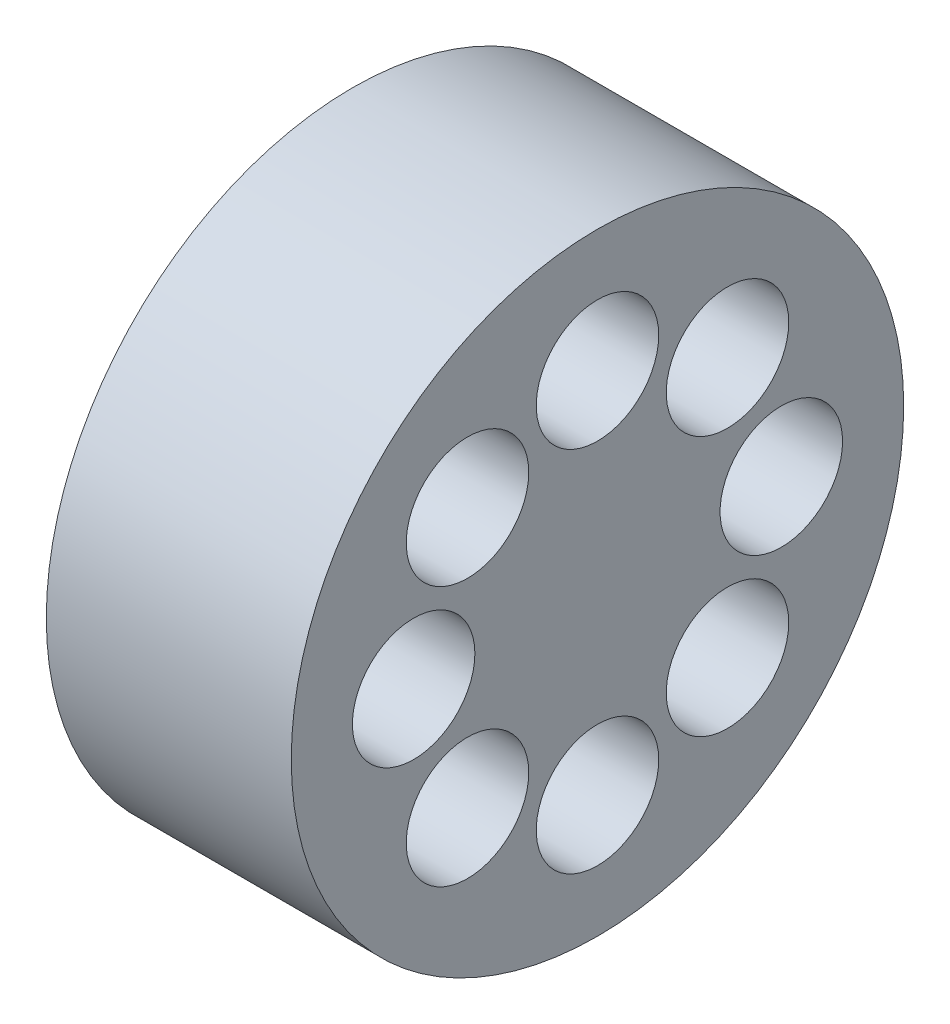
ISO-10303-21;
HEADER;
FILE_DESCRIPTION(('STEP AP214'),'2;1');
FILE_NAME('part.step','',(''),(''),'','','');
FILE_SCHEMA(('AUTOMOTIVE_DESIGN { 1 0 10303 214 1 1 1 1 }'));
ENDSEC;
DATA;
#1=APPLICATION_CONTEXT('core data for automotive mechanical design processes');
#2=APPLICATION_PROTOCOL_DEFINITION('international standard','automotive_design',2000,#1);
#3=PRODUCT_CONTEXT('',#1,'mechanical');
#4=PRODUCT('Part','Part','',(#3));
#5=PRODUCT_RELATED_PRODUCT_CATEGORY('part','',(#4));
#6=PRODUCT_DEFINITION_FORMATION('','',#4);
#7=PRODUCT_DEFINITION_CONTEXT('part definition',#1,'design');
#8=PRODUCT_DEFINITION('design','',#6,#7);
#9=PRODUCT_DEFINITION_SHAPE('','',#8);
#10=(LENGTH_UNIT() NAMED_UNIT(*) SI_UNIT(.MILLI.,.METRE.));
#11=(NAMED_UNIT(*) PLANE_ANGLE_UNIT() SI_UNIT($,.RADIAN.));
#12=(NAMED_UNIT(*) SI_UNIT($,.STERADIAN.) SOLID_ANGLE_UNIT());
#13=UNCERTAINTY_MEASURE_WITH_UNIT(LENGTH_MEASURE(1.E-05),#10,'distance_accuracy_value','');
#14=(GEOMETRIC_REPRESENTATION_CONTEXT(3) GLOBAL_UNCERTAINTY_ASSIGNED_CONTEXT((#13)) GLOBAL_UNIT_ASSIGNED_CONTEXT((#10,
#11,#12)) REPRESENTATION_CONTEXT('',''));
#15=CARTESIAN_POINT('',(0.,0.,0.));
#16=DIRECTION('',(0.,0.,1.));
#17=DIRECTION('',(1.,0.,0.));
#18=AXIS2_PLACEMENT_3D('',#15,#16,#17);
#19=CARTESIAN_POINT('',(40.,0.,0.));
#20=DIRECTION('',(1.,0.,0.));
#21=DIRECTION('',(0.,0.,-1.));
#22=AXIS2_PLACEMENT_3D('',#19,#20,#21);
#23=PLANE('',#22);
#24=CARTESIAN_POINT('',(40.,30.0190420048161,-3.14432774909291E-13));
#25=DIRECTION('',(1.,0.,0.));
#26=DIRECTION('',(0.,0.,-1.));
#27=AXIS2_PLACEMENT_3D('',#24,#25,#26);
#28=CIRCLE('',#27,10.);
#29=CARTESIAN_POINT('',(40.,30.0190420048161,-10.0000000000003));
#30=VERTEX_POINT('',#29);
#31=EDGE_CURVE('E100',#30,#30,#28,.T.);
#32=ORIENTED_EDGE('',*,*,#31,.F.);
#33=EDGE_LOOP('',(#32));
#34=FACE_BOUND('',#33,.T.);
#35=CARTESIAN_POINT('',(40.,2.09621849939527E-13,30.0190420048161));
#36=DIRECTION('',(1.,0.,0.));
#37=DIRECTION('',(0.,0.,-1.));
#38=AXIS2_PLACEMENT_3D('',#35,#36,#37);
#39=CIRCLE('',#38,10.);
#40=CARTESIAN_POINT('',(40.,2.09621849939527E-13,20.0190420048161));
#41=VERTEX_POINT('',#40);
#42=EDGE_CURVE('E84',#41,#41,#39,.T.);
#43=ORIENTED_EDGE('',*,*,#42,.F.);
#44=EDGE_LOOP('',(#43));
#45=FACE_BOUND('',#44,.T.);
#46=CARTESIAN_POINT('',(40.,-30.0190420048161,1.04810924969764E-13));
#47=DIRECTION('',(1.,0.,0.));
#48=DIRECTION('',(0.,0.,-1.));
#49=AXIS2_PLACEMENT_3D('',#46,#47,#48);
#50=CIRCLE('',#49,10.);
#51=CARTESIAN_POINT('',(40.,-30.0190420048161,-9.9999999999999));
#52=VERTEX_POINT('',#51);
#53=EDGE_CURVE('E68',#52,#52,#50,.T.);
#54=ORIENTED_EDGE('',*,*,#53,.F.);
#55=EDGE_LOOP('',(#54));
#56=FACE_BOUND('',#55,.T.);
#57=CARTESIAN_POINT('',(40.,0.,-30.0190420048161));
#58=DIRECTION('',(1.,0.,0.));
#59=DIRECTION('',(0.,0.,-1.));
#60=AXIS2_PLACEMENT_3D('',#57,#58,#59);
#61=CIRCLE('',#60,10.);
#62=CARTESIAN_POINT('',(40.,0.,-40.0190420048161));
#63=VERTEX_POINT('',#62);
#64=EDGE_CURVE('E54',#63,#63,#61,.T.);
#65=ORIENTED_EDGE('',*,*,#64,.F.);
#66=EDGE_LOOP('',(#65));
#67=FACE_BOUND('',#66,.T.);
#68=CARTESIAN_POINT('',(40.,0.,0.));
#69=DIRECTION('',(1.,0.,0.));
#70=DIRECTION('',(0.,0.,-1.));
#71=AXIS2_PLACEMENT_3D('',#68,#69,#70);
#72=CIRCLE('',#71,50.);
#73=CARTESIAN_POINT('',(40.,0.,-50.));
#74=VERTEX_POINT('',#73);
#75=EDGE_CURVE('E10',#74,#74,#72,.T.);
#76=ORIENTED_EDGE('',*,*,#75,.T.);
#77=EDGE_LOOP('',(#76));
#78=FACE_BOUND('',#77,.T.);
#79=CARTESIAN_POINT('',(40.,-21.2266681663293,-21.2266681663293));
#80=DIRECTION('',(1.,0.,0.));
#81=DIRECTION('',(0.,0.,-1.));
#82=AXIS2_PLACEMENT_3D('',#79,#80,#81);
#83=CIRCLE('',#82,10.);
#84=CARTESIAN_POINT('',(40.,-21.2266681663293,-31.2266681663293));
#85=VERTEX_POINT('',#84);
#86=EDGE_CURVE('E60',#85,#85,#83,.T.);
#87=ORIENTED_EDGE('',*,*,#86,.F.);
#88=EDGE_LOOP('',(#87));
#89=FACE_BOUND('',#88,.T.);
#90=CARTESIAN_POINT('',(40.,-21.2266681663292,21.2266681663294));
#91=DIRECTION('',(1.,0.,0.));
#92=DIRECTION('',(0.,0.,-1.));
#93=AXIS2_PLACEMENT_3D('',#90,#91,#92);
#94=CIRCLE('',#93,10.);
#95=CARTESIAN_POINT('',(40.,-21.2266681663292,11.2266681663294));
#96=VERTEX_POINT('',#95);
#97=EDGE_CURVE('E76',#96,#96,#94,.T.);
#98=ORIENTED_EDGE('',*,*,#97,.F.);
#99=EDGE_LOOP('',(#98));
#100=FACE_BOUND('',#99,.T.);
#101=CARTESIAN_POINT('',(40.,21.2266681663295,21.2266681663291));
#102=DIRECTION('',(1.,0.,0.));
#103=DIRECTION('',(0.,0.,-1.));
#104=AXIS2_PLACEMENT_3D('',#101,#102,#103);
#105=CIRCLE('',#104,10.);
#106=CARTESIAN_POINT('',(40.,21.2266681663295,11.2266681663291));
#107=VERTEX_POINT('',#106);
#108=EDGE_CURVE('E92',#107,#107,#105,.T.);
#109=ORIENTED_EDGE('',*,*,#108,.F.);
#110=EDGE_LOOP('',(#109));
#111=FACE_BOUND('',#110,.T.);
#112=CARTESIAN_POINT('',(40.,21.226668166329,-21.2266681663296));
#113=DIRECTION('',(1.,0.,0.));
#114=DIRECTION('',(0.,0.,-1.));
#115=AXIS2_PLACEMENT_3D('',#112,#113,#114);
#116=CIRCLE('',#115,10.);
#117=CARTESIAN_POINT('',(40.,21.226668166329,-31.2266681663296));
#118=VERTEX_POINT('',#117);
#119=EDGE_CURVE('E108',#118,#118,#116,.T.);
#120=ORIENTED_EDGE('',*,*,#119,.F.);
#121=EDGE_LOOP('',(#120));
#122=FACE_BOUND('',#121,.T.);
#123=ADVANCED_FACE('F41',(#34,#45,#56,#67,#78,#89,#100,#111,#122),#23,.T.);
#124=CARTESIAN_POINT('',(0.,0.,0.));
#125=DIRECTION('',(1.,0.,0.));
#126=DIRECTION('',(0.,0.,-1.));
#127=AXIS2_PLACEMENT_3D('',#124,#125,#126);
#128=PLANE('',#127);
#129=CARTESIAN_POINT('',(0.,0.,0.));
#130=DIRECTION('',(1.,0.,0.));
#131=DIRECTION('',(0.,0.,-1.));
#132=AXIS2_PLACEMENT_3D('',#129,#130,#131);
#133=CIRCLE('',#132,50.);
#134=CARTESIAN_POINT('',(0.,0.,-50.));
#135=VERTEX_POINT('',#134);
#136=EDGE_CURVE('E45',#135,#135,#133,.T.);
#137=ORIENTED_EDGE('',*,*,#136,.F.);
#138=EDGE_LOOP('',(#137));
#139=FACE_BOUND('',#138,.T.);
#140=CARTESIAN_POINT('',(0.,0.,-30.0190420048161));
#141=DIRECTION('',(1.,0.,0.));
#142=DIRECTION('',(0.,0.,-1.));
#143=AXIS2_PLACEMENT_3D('',#140,#141,#142);
#144=CIRCLE('',#143,10.);
#145=CARTESIAN_POINT('',(0.,0.,-40.0190420048161));
#146=VERTEX_POINT('',#145);
#147=EDGE_CURVE('E56',#146,#146,#144,.T.);
#148=ORIENTED_EDGE('',*,*,#147,.T.);
#149=EDGE_LOOP('',(#148));
#150=FACE_BOUND('',#149,.T.);
#151=CARTESIAN_POINT('',(0.,-21.2266681663293,-21.2266681663293));
#152=DIRECTION('',(1.,0.,0.));
#153=DIRECTION('',(0.,0.,-1.));
#154=AXIS2_PLACEMENT_3D('',#151,#152,#153);
#155=CIRCLE('',#154,10.);
#156=CARTESIAN_POINT('',(0.,-21.2266681663293,-31.2266681663293));
#157=VERTEX_POINT('',#156);
#158=EDGE_CURVE('E64',#157,#157,#155,.T.);
#159=ORIENTED_EDGE('',*,*,#158,.T.);
#160=EDGE_LOOP('',(#159));
#161=FACE_BOUND('',#160,.T.);
#162=CARTESIAN_POINT('',(0.,-30.0190420048161,1.04810924969764E-13));
#163=DIRECTION('',(1.,0.,0.));
#164=DIRECTION('',(0.,0.,-1.));
#165=AXIS2_PLACEMENT_3D('',#162,#163,#164);
#166=CIRCLE('',#165,10.);
#167=CARTESIAN_POINT('',(0.,-30.0190420048161,-9.9999999999999));
#168=VERTEX_POINT('',#167);
#169=EDGE_CURVE('E72',#168,#168,#166,.T.);
#170=ORIENTED_EDGE('',*,*,#169,.T.);
#171=EDGE_LOOP('',(#170));
#172=FACE_BOUND('',#171,.T.);
#173=CARTESIAN_POINT('',(0.,-21.2266681663292,21.2266681663294));
#174=DIRECTION('',(1.,0.,0.));
#175=DIRECTION('',(0.,0.,-1.));
#176=AXIS2_PLACEMENT_3D('',#173,#174,#175);
#177=CIRCLE('',#176,10.);
#178=CARTESIAN_POINT('',(0.,-21.2266681663292,11.2266681663294));
#179=VERTEX_POINT('',#178);
#180=EDGE_CURVE('E80',#179,#179,#177,.T.);
#181=ORIENTED_EDGE('',*,*,#180,.T.);
#182=EDGE_LOOP('',(#181));
#183=FACE_BOUND('',#182,.T.);
#184=CARTESIAN_POINT('',(0.,2.09621849939527E-13,30.0190420048161));
#185=DIRECTION('',(1.,0.,0.));
#186=DIRECTION('',(0.,0.,-1.));
#187=AXIS2_PLACEMENT_3D('',#184,#185,#186);
#188=CIRCLE('',#187,10.);
#189=CARTESIAN_POINT('',(0.,2.09621849939527E-13,20.0190420048161));
#190=VERTEX_POINT('',#189);
#191=EDGE_CURVE('E88',#190,#190,#188,.T.);
#192=ORIENTED_EDGE('',*,*,#191,.T.);
#193=EDGE_LOOP('',(#192));
#194=FACE_BOUND('',#193,.T.);
#195=CARTESIAN_POINT('',(0.,21.2266681663295,21.2266681663291));
#196=DIRECTION('',(1.,0.,0.));
#197=DIRECTION('',(0.,0.,-1.));
#198=AXIS2_PLACEMENT_3D('',#195,#196,#197);
#199=CIRCLE('',#198,10.);
#200=CARTESIAN_POINT('',(0.,21.2266681663295,11.2266681663291));
#201=VERTEX_POINT('',#200);
#202=EDGE_CURVE('E96',#201,#201,#199,.T.);
#203=ORIENTED_EDGE('',*,*,#202,.T.);
#204=EDGE_LOOP('',(#203));
#205=FACE_BOUND('',#204,.T.);
#206=CARTESIAN_POINT('',(0.,30.0190420048161,-3.14432774909291E-13));
#207=DIRECTION('',(1.,0.,0.));
#208=DIRECTION('',(0.,0.,-1.));
#209=AXIS2_PLACEMENT_3D('',#206,#207,#208);
#210=CIRCLE('',#209,10.);
#211=CARTESIAN_POINT('',(0.,30.0190420048161,-10.0000000000003));
#212=VERTEX_POINT('',#211);
#213=EDGE_CURVE('E104',#212,#212,#210,.T.);
#214=ORIENTED_EDGE('',*,*,#213,.T.);
#215=EDGE_LOOP('',(#214));
#216=FACE_BOUND('',#215,.T.);
#217=CARTESIAN_POINT('',(0.,21.226668166329,-21.2266681663296));
#218=DIRECTION('',(1.,0.,0.));
#219=DIRECTION('',(0.,0.,-1.));
#220=AXIS2_PLACEMENT_3D('',#217,#218,#219);
#221=CIRCLE('',#220,10.);
#222=CARTESIAN_POINT('',(0.,21.226668166329,-31.2266681663296));
#223=VERTEX_POINT('',#222);
#224=EDGE_CURVE('E112',#223,#223,#221,.T.);
#225=ORIENTED_EDGE('',*,*,#224,.T.);
#226=EDGE_LOOP('',(#225));
#227=FACE_BOUND('',#226,.T.);
#228=ADVANCED_FACE('F124',(#139,#150,#161,#172,#183,#194,#205,#216,#227),#128,.F.);
#229=CARTESIAN_POINT('',(40.,0.,0.));
#230=DIRECTION('',(-1.,0.,0.));
#231=DIRECTION('',(0.,0.,1.));
#232=AXIS2_PLACEMENT_3D('',#229,#230,#231);
#233=CYLINDRICAL_SURFACE('',#232,50.);
#234=ORIENTED_EDGE('',*,*,#75,.F.);
#235=EDGE_LOOP('',(#234));
#236=FACE_BOUND('',#235,.T.);
#237=ORIENTED_EDGE('',*,*,#136,.T.);
#238=EDGE_LOOP('',(#237));
#239=FACE_BOUND('',#238,.T.);
#240=ADVANCED_FACE('F43',(#236,#239),#233,.T.);
#241=CARTESIAN_POINT('',(40.,0.,-30.0190420048161));
#242=DIRECTION('',(-1.,0.,0.));
#243=DIRECTION('',(0.,0.,1.));
#244=AXIS2_PLACEMENT_3D('',#241,#242,#243);
#245=CYLINDRICAL_SURFACE('',#244,10.);
#246=ORIENTED_EDGE('',*,*,#64,.T.);
#247=EDGE_LOOP('',(#246));
#248=FACE_BOUND('',#247,.T.);
#249=ORIENTED_EDGE('',*,*,#147,.F.);
#250=EDGE_LOOP('',(#249));
#251=FACE_BOUND('',#250,.T.);
#252=ADVANCED_FACE('F134',(#248,#251),#245,.F.);
#253=CARTESIAN_POINT('',(40.,-21.2266681663293,-21.2266681663293));
#254=DIRECTION('',(-1.,0.,0.));
#255=DIRECTION('',(0.,0.,1.));
#256=AXIS2_PLACEMENT_3D('',#253,#254,#255);
#257=CYLINDRICAL_SURFACE('',#256,10.);
#258=ORIENTED_EDGE('',*,*,#86,.T.);
#259=EDGE_LOOP('',(#258));
#260=FACE_BOUND('',#259,.T.);
#261=ORIENTED_EDGE('',*,*,#158,.F.);
#262=EDGE_LOOP('',(#261));
#263=FACE_BOUND('',#262,.T.);
#264=ADVANCED_FACE('F137',(#260,#263),#257,.F.);
#265=CARTESIAN_POINT('',(40.,-30.0190420048161,1.04810924969764E-13));
#266=DIRECTION('',(-1.,0.,0.));
#267=DIRECTION('',(0.,0.,1.));
#268=AXIS2_PLACEMENT_3D('',#265,#266,#267);
#269=CYLINDRICAL_SURFACE('',#268,10.);
#270=ORIENTED_EDGE('',*,*,#53,.T.);
#271=EDGE_LOOP('',(#270));
#272=FACE_BOUND('',#271,.T.);
#273=ORIENTED_EDGE('',*,*,#169,.F.);
#274=EDGE_LOOP('',(#273));
#275=FACE_BOUND('',#274,.T.);
#276=ADVANCED_FACE('F141',(#272,#275),#269,.F.);
#277=CARTESIAN_POINT('',(40.,-21.2266681663292,21.2266681663294));
#278=DIRECTION('',(-1.,0.,0.));
#279=DIRECTION('',(0.,0.,1.));
#280=AXIS2_PLACEMENT_3D('',#277,#278,#279);
#281=CYLINDRICAL_SURFACE('',#280,10.);
#282=ORIENTED_EDGE('',*,*,#97,.T.);
#283=EDGE_LOOP('',(#282));
#284=FACE_BOUND('',#283,.T.);
#285=ORIENTED_EDGE('',*,*,#180,.F.);
#286=EDGE_LOOP('',(#285));
#287=FACE_BOUND('',#286,.T.);
#288=ADVANCED_FACE('F145',(#284,#287),#281,.F.);
#289=CARTESIAN_POINT('',(40.,2.09621849939527E-13,30.0190420048161));
#290=DIRECTION('',(-1.,0.,0.));
#291=DIRECTION('',(0.,0.,1.));
#292=AXIS2_PLACEMENT_3D('',#289,#290,#291);
#293=CYLINDRICAL_SURFACE('',#292,10.);
#294=ORIENTED_EDGE('',*,*,#42,.T.);
#295=EDGE_LOOP('',(#294));
#296=FACE_BOUND('',#295,.T.);
#297=ORIENTED_EDGE('',*,*,#191,.F.);
#298=EDGE_LOOP('',(#297));
#299=FACE_BOUND('',#298,.T.);
#300=ADVANCED_FACE('F149',(#296,#299),#293,.F.);
#301=CARTESIAN_POINT('',(40.,21.2266681663295,21.2266681663291));
#302=DIRECTION('',(-1.,0.,0.));
#303=DIRECTION('',(0.,0.,1.));
#304=AXIS2_PLACEMENT_3D('',#301,#302,#303);
#305=CYLINDRICAL_SURFACE('',#304,10.);
#306=ORIENTED_EDGE('',*,*,#108,.T.);
#307=EDGE_LOOP('',(#306));
#308=FACE_BOUND('',#307,.T.);
#309=ORIENTED_EDGE('',*,*,#202,.F.);
#310=EDGE_LOOP('',(#309));
#311=FACE_BOUND('',#310,.T.);
#312=ADVANCED_FACE('F153',(#308,#311),#305,.F.);
#313=CARTESIAN_POINT('',(40.,30.0190420048161,-3.14432774909291E-13));
#314=DIRECTION('',(-1.,0.,0.));
#315=DIRECTION('',(0.,0.,1.));
#316=AXIS2_PLACEMENT_3D('',#313,#314,#315);
#317=CYLINDRICAL_SURFACE('',#316,10.);
#318=ORIENTED_EDGE('',*,*,#31,.T.);
#319=EDGE_LOOP('',(#318));
#320=FACE_BOUND('',#319,.T.);
#321=ORIENTED_EDGE('',*,*,#213,.F.);
#322=EDGE_LOOP('',(#321));
#323=FACE_BOUND('',#322,.T.);
#324=ADVANCED_FACE('F157',(#320,#323),#317,.F.);
#325=CARTESIAN_POINT('',(40.,21.226668166329,-21.2266681663296));
#326=DIRECTION('',(-1.,0.,0.));
#327=DIRECTION('',(0.,0.,1.));
#328=AXIS2_PLACEMENT_3D('',#325,#326,#327);
#329=CYLINDRICAL_SURFACE('',#328,10.);
#330=ORIENTED_EDGE('',*,*,#119,.T.);
#331=EDGE_LOOP('',(#330));
#332=FACE_BOUND('',#331,.T.);
#333=ORIENTED_EDGE('',*,*,#224,.F.);
#334=EDGE_LOOP('',(#333));
#335=FACE_BOUND('',#334,.T.);
#336=ADVANCED_FACE('F120',(#332,#335),#329,.F.);
#337=CLOSED_SHELL('',(#123,#228,#240,#252,#264,#276,#288,#300,#312,#324,#336));
#338=MANIFOLD_SOLID_BREP('B2',#337);
#339=ADVANCED_BREP_SHAPE_REPRESENTATION('',(#18,#338),#14);
#340=SHAPE_DEFINITION_REPRESENTATION(#9,#339);
ENDSEC;
END-ISO-10303-21;
